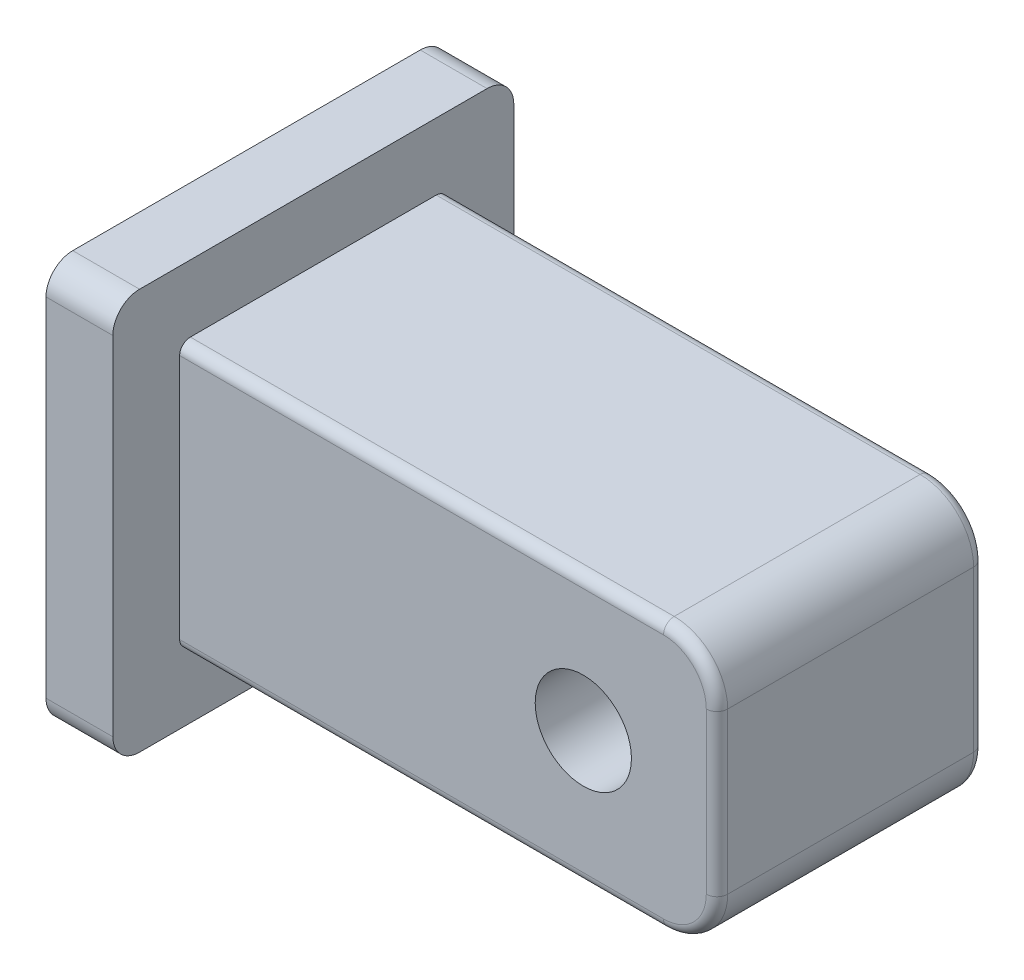
ISO-10303-21;
HEADER;
FILE_DESCRIPTION(('STEP AP214'),'2;1');
FILE_NAME('part.step','',(''),(''),'','','');
FILE_SCHEMA(('AUTOMOTIVE_DESIGN { 1 0 10303 214 1 1 1 1 }'));
ENDSEC;
DATA;
#1=APPLICATION_CONTEXT('core data for automotive mechanical design processes');
#2=APPLICATION_PROTOCOL_DEFINITION('international standard','automotive_design',2000,#1);
#3=PRODUCT_CONTEXT('',#1,'mechanical');
#4=PRODUCT('Part','Part','',(#3));
#5=PRODUCT_RELATED_PRODUCT_CATEGORY('part','',(#4));
#6=PRODUCT_DEFINITION_FORMATION('','',#4);
#7=PRODUCT_DEFINITION_CONTEXT('part definition',#1,'design');
#8=PRODUCT_DEFINITION('design','',#6,#7);
#9=PRODUCT_DEFINITION_SHAPE('','',#8);
#10=(LENGTH_UNIT() NAMED_UNIT(*) SI_UNIT(.MILLI.,.METRE.));
#11=(NAMED_UNIT(*) PLANE_ANGLE_UNIT() SI_UNIT($,.RADIAN.));
#12=(NAMED_UNIT(*) SI_UNIT($,.STERADIAN.) SOLID_ANGLE_UNIT());
#13=UNCERTAINTY_MEASURE_WITH_UNIT(LENGTH_MEASURE(1.E-05),#10,'distance_accuracy_value','');
#14=(GEOMETRIC_REPRESENTATION_CONTEXT(3) GLOBAL_UNCERTAINTY_ASSIGNED_CONTEXT((#13)) GLOBAL_UNIT_ASSIGNED_CONTEXT((#10,
#11,#12)) REPRESENTATION_CONTEXT('',''));
#15=CARTESIAN_POINT('',(0.,0.,0.));
#16=DIRECTION('',(0.,0.,1.));
#17=DIRECTION('',(1.,0.,0.));
#18=AXIS2_PLACEMENT_3D('',#15,#16,#17);
#19=CARTESIAN_POINT('',(0.,0.,12.7));
#20=DIRECTION('',(0.,-1.,0.));
#21=DIRECTION('',(1.,0.,0.));
#22=AXIS2_PLACEMENT_3D('',#19,#20,#21);
#23=PLANE('',#22);
#24=DIRECTION('',(0.,0.,-1.));
#25=VECTOR('',#24,1.);
#26=CARTESIAN_POINT('',(-2.54,0.,12.7));
#27=LINE('',#26,#25);
#28=CARTESIAN_POINT('',(-2.54,0.,12.192));
#29=VERTEX_POINT('',#28);
#30=CARTESIAN_POINT('',(-2.54,0.,0.508));
#31=VERTEX_POINT('',#30);
#32=EDGE_CURVE('E417',#29,#31,#27,.T.);
#33=ORIENTED_EDGE('',*,*,#32,.T.);
#34=DIRECTION('',(-1.,0.,0.));
#35=VECTOR('',#34,1.);
#36=CARTESIAN_POINT('',(-25.527,0.,0.508));
#37=LINE('',#36,#35);
#38=CARTESIAN_POINT('',(-25.527,0.,0.508));
#39=VERTEX_POINT('',#38);
#40=EDGE_CURVE('E195',#31,#39,#37,.T.);
#41=ORIENTED_EDGE('',*,*,#40,.T.);
#42=DIRECTION('',(0.,0.,-1.));
#43=VECTOR('',#42,1.);
#44=CARTESIAN_POINT('',(-25.527,0.,12.7));
#45=LINE('',#44,#43);
#46=CARTESIAN_POINT('',(-25.527,0.,12.192));
#47=VERTEX_POINT('',#46);
#48=EDGE_CURVE('E206',#47,#39,#45,.T.);
#49=ORIENTED_EDGE('',*,*,#48,.F.);
#50=DIRECTION('',(-1.,0.,0.));
#51=VECTOR('',#50,1.);
#52=CARTESIAN_POINT('',(0.,0.,12.192));
#53=LINE('',#52,#51);
#54=EDGE_CURVE('E268',#47,#29,#53,.F.);
#55=ORIENTED_EDGE('',*,*,#54,.T.);
#56=EDGE_LOOP('',(#33,#41,#49,#55));
#57=FACE_BOUND('',#56,.T.);
#58=ADVANCED_FACE('F43',(#57),#23,.F.);
#59=CARTESIAN_POINT('',(0.,-12.7,12.7));
#60=DIRECTION('',(0.,1.,0.));
#61=DIRECTION('',(-1.,0.,0.));
#62=AXIS2_PLACEMENT_3D('',#59,#60,#61);
#63=PLANE('',#62);
#64=DIRECTION('',(0.,0.,1.));
#65=VECTOR('',#64,1.);
#66=CARTESIAN_POINT('',(-25.527,-12.7,12.7));
#67=LINE('',#66,#65);
#68=CARTESIAN_POINT('',(-25.527,-12.7,0.508));
#69=VERTEX_POINT('',#68);
#70=CARTESIAN_POINT('',(-25.527,-12.7,12.192));
#71=VERTEX_POINT('',#70);
#72=EDGE_CURVE('E186',#69,#71,#67,.T.);
#73=ORIENTED_EDGE('',*,*,#72,.F.);
#74=DIRECTION('',(1.,0.,0.));
#75=VECTOR('',#74,1.);
#76=CARTESIAN_POINT('',(-2.54,-12.7,0.508));
#77=LINE('',#76,#75);
#78=CARTESIAN_POINT('',(-2.54,-12.7,0.508));
#79=VERTEX_POINT('',#78);
#80=EDGE_CURVE('E201',#69,#79,#77,.T.);
#81=ORIENTED_EDGE('',*,*,#80,.T.);
#82=DIRECTION('',(0.,0.,-1.));
#83=VECTOR('',#82,1.);
#84=CARTESIAN_POINT('',(-2.54,-12.7,12.7));
#85=LINE('',#84,#83);
#86=CARTESIAN_POINT('',(-2.54,-12.7,12.192));
#87=VERTEX_POINT('',#86);
#88=EDGE_CURVE('E414',#79,#87,#85,.F.);
#89=ORIENTED_EDGE('',*,*,#88,.T.);
#90=DIRECTION('',(1.,0.,0.));
#91=VECTOR('',#90,1.);
#92=CARTESIAN_POINT('',(0.,-12.7,12.192));
#93=LINE('',#92,#91);
#94=EDGE_CURVE('E204',#87,#71,#93,.F.);
#95=ORIENTED_EDGE('',*,*,#94,.T.);
#96=EDGE_LOOP('',(#73,#81,#89,#95));
#97=FACE_BOUND('',#96,.T.);
#98=ADVANCED_FACE('F199',(#97),#63,.F.);
#99=CARTESIAN_POINT('',(0.,0.,12.7));
#100=DIRECTION('',(0.,0.,-1.));
#101=DIRECTION('',(-1.,0.,0.));
#102=AXIS2_PLACEMENT_3D('',#99,#100,#101);
#103=PLANE('',#102);
#104=CARTESIAN_POINT('',(-6.35,-6.35,12.7));
#105=DIRECTION('',(0.,0.,-1.));
#106=DIRECTION('',(-1.,0.,0.));
#107=AXIS2_PLACEMENT_3D('',#104,#105,#106);
#108=CIRCLE('',#107,2.286);
#109=CARTESIAN_POINT('',(-8.636,-6.35,12.7));
#110=VERTEX_POINT('',#109);
#111=EDGE_CURVE('E402',#110,#110,#108,.T.);
#112=ORIENTED_EDGE('',*,*,#111,.T.);
#113=EDGE_LOOP('',(#112));
#114=FACE_BOUND('',#113,.T.);
#115=DIRECTION('',(0.,1.,0.));
#116=VECTOR('',#115,1.);
#117=CARTESIAN_POINT('',(-25.527,0.,12.7));
#118=LINE('',#117,#116);
#119=CARTESIAN_POINT('',(-25.527,-12.192,12.7));
#120=VERTEX_POINT('',#119);
#121=CARTESIAN_POINT('',(-25.527,-0.508000000000003,12.7));
#122=VERTEX_POINT('',#121);
#123=EDGE_CURVE('E394',#120,#122,#118,.T.);
#124=ORIENTED_EDGE('',*,*,#123,.F.);
#125=DIRECTION('',(1.,0.,0.));
#126=VECTOR('',#125,1.);
#127=CARTESIAN_POINT('',(0.,-12.192,12.7));
#128=LINE('',#127,#126);
#129=CARTESIAN_POINT('',(-2.54,-12.192,12.7));
#130=VERTEX_POINT('',#129);
#131=EDGE_CURVE('E264',#120,#130,#128,.T.);
#132=ORIENTED_EDGE('',*,*,#131,.T.);
#133=CARTESIAN_POINT('',(-2.54,-10.16,12.7));
#134=DIRECTION('',(0.,0.,-1.));
#135=DIRECTION('',(-1.,0.,0.));
#136=AXIS2_PLACEMENT_3D('',#133,#134,#135);
#137=CIRCLE('',#136,2.032);
#138=CARTESIAN_POINT('',(-0.507999999999999,-10.16,12.7));
#139=VERTEX_POINT('',#138);
#140=EDGE_CURVE('E261',#130,#139,#137,.F.);
#141=ORIENTED_EDGE('',*,*,#140,.T.);
#142=DIRECTION('',(0.,1.,0.));
#143=VECTOR('',#142,1.);
#144=CARTESIAN_POINT('',(-0.508,0.,12.7));
#145=LINE('',#144,#143);
#146=CARTESIAN_POINT('',(-0.508,-2.54,12.7));
#147=VERTEX_POINT('',#146);
#148=EDGE_CURVE('E258',#139,#147,#145,.T.);
#149=ORIENTED_EDGE('',*,*,#148,.T.);
#150=CARTESIAN_POINT('',(-2.54,-2.54,12.7));
#151=DIRECTION('',(0.,0.,-1.));
#152=DIRECTION('',(-1.,0.,0.));
#153=AXIS2_PLACEMENT_3D('',#150,#151,#152);
#154=CIRCLE('',#153,2.032);
#155=CARTESIAN_POINT('',(-2.54,-0.508,12.7));
#156=VERTEX_POINT('',#155);
#157=EDGE_CURVE('E255',#147,#156,#154,.F.);
#158=ORIENTED_EDGE('',*,*,#157,.T.);
#159=DIRECTION('',(-1.,0.,0.));
#160=VECTOR('',#159,1.);
#161=CARTESIAN_POINT('',(0.,-0.508,12.7));
#162=LINE('',#161,#160);
#163=EDGE_CURVE('E252',#156,#122,#162,.T.);
#164=ORIENTED_EDGE('',*,*,#163,.T.);
#165=EDGE_LOOP('',(#124,#132,#141,#149,#158,#164));
#166=FACE_BOUND('',#165,.T.);
#167=ADVANCED_FACE('F465',(#114,#166),#103,.F.);
#168=CARTESIAN_POINT('',(0.,0.,0.));
#169=DIRECTION('',(0.,0.,-1.));
#170=DIRECTION('',(-1.,0.,0.));
#171=AXIS2_PLACEMENT_3D('',#168,#169,#170);
#172=PLANE('',#171);
#173=CARTESIAN_POINT('',(-6.35,-6.35,0.));
#174=DIRECTION('',(0.,0.,1.));
#175=DIRECTION('',(1.,0.,0.));
#176=AXIS2_PLACEMENT_3D('',#173,#174,#175);
#177=CIRCLE('',#176,2.286);
#178=CARTESIAN_POINT('',(-4.064,-6.35,0.));
#179=VERTEX_POINT('',#178);
#180=EDGE_CURVE('E398',#179,#179,#177,.T.);
#181=ORIENTED_EDGE('',*,*,#180,.T.);
#182=EDGE_LOOP('',(#181));
#183=FACE_BOUND('',#182,.T.);
#184=CARTESIAN_POINT('',(-2.54,-10.16,0.));
#185=DIRECTION('',(0.,0.,-1.));
#186=DIRECTION('',(-1.,0.,0.));
#187=AXIS2_PLACEMENT_3D('',#184,#185,#186);
#188=CIRCLE('',#187,2.032);
#189=CARTESIAN_POINT('',(-0.507999999999999,-10.16,0.));
#190=VERTEX_POINT('',#189);
#191=CARTESIAN_POINT('',(-2.54,-12.192,0.));
#192=VERTEX_POINT('',#191);
#193=EDGE_CURVE('E228',#190,#192,#188,.T.);
#194=ORIENTED_EDGE('',*,*,#193,.T.);
#195=DIRECTION('',(1.,0.,0.));
#196=VECTOR('',#195,1.);
#197=CARTESIAN_POINT('',(-25.527,-12.192,0.));
#198=LINE('',#197,#196);
#199=CARTESIAN_POINT('',(-25.527,-12.192,0.));
#200=VERTEX_POINT('',#199);
#201=EDGE_CURVE('E231',#192,#200,#198,.F.);
#202=ORIENTED_EDGE('',*,*,#201,.T.);
#203=DIRECTION('',(0.,1.,0.));
#204=VECTOR('',#203,1.);
#205=CARTESIAN_POINT('',(-25.527,0.,0.));
#206=LINE('',#205,#204);
#207=CARTESIAN_POINT('',(-25.527,-0.508000000000003,0.));
#208=VERTEX_POINT('',#207);
#209=EDGE_CURVE('E189',#200,#208,#206,.T.);
#210=ORIENTED_EDGE('',*,*,#209,.T.);
#211=DIRECTION('',(-1.,0.,0.));
#212=VECTOR('',#211,1.);
#213=CARTESIAN_POINT('',(-2.54,-0.508,0.));
#214=LINE('',#213,#212);
#215=CARTESIAN_POINT('',(-2.54,-0.508,0.));
#216=VERTEX_POINT('',#215);
#217=EDGE_CURVE('E214',#208,#216,#214,.F.);
#218=ORIENTED_EDGE('',*,*,#217,.T.);
#219=CARTESIAN_POINT('',(-2.54,-2.54,0.));
#220=DIRECTION('',(0.,0.,-1.));
#221=DIRECTION('',(-1.,0.,0.));
#222=AXIS2_PLACEMENT_3D('',#219,#220,#221);
#223=CIRCLE('',#222,2.032);
#224=CARTESIAN_POINT('',(-0.508,-2.54,0.));
#225=VERTEX_POINT('',#224);
#226=EDGE_CURVE('E218',#216,#225,#223,.T.);
#227=ORIENTED_EDGE('',*,*,#226,.T.);
#228=DIRECTION('',(0.,1.,0.));
#229=VECTOR('',#228,1.);
#230=CARTESIAN_POINT('',(-0.507999999999999,-10.16,0.));
#231=LINE('',#230,#229);
#232=EDGE_CURVE('E225',#225,#190,#231,.F.);
#233=ORIENTED_EDGE('',*,*,#232,.T.);
#234=EDGE_LOOP('',(#194,#202,#210,#218,#227,#233));
#235=FACE_BOUND('',#234,.T.);
#236=ADVANCED_FACE('F423',(#183,#235),#172,.T.);
#237=CARTESIAN_POINT('',(0.,0.,12.7));
#238=DIRECTION('',(-1.,0.,0.));
#239=DIRECTION('',(0.,-1.,0.));
#240=AXIS2_PLACEMENT_3D('',#237,#238,#239);
#241=PLANE('',#240);
#242=DIRECTION('',(0.,0.,-1.));
#243=VECTOR('',#242,1.);
#244=CARTESIAN_POINT('',(0.,-10.16,12.7));
#245=LINE('',#244,#243);
#246=CARTESIAN_POINT('',(0.,-10.16,12.192));
#247=VERTEX_POINT('',#246);
#248=CARTESIAN_POINT('',(0.,-10.16,0.508));
#249=VERTEX_POINT('',#248);
#250=EDGE_CURVE('E410',#247,#249,#245,.T.);
#251=ORIENTED_EDGE('',*,*,#250,.T.);
#252=DIRECTION('',(0.,1.,0.));
#253=VECTOR('',#252,1.);
#254=CARTESIAN_POINT('',(0.,-2.54,0.508));
#255=LINE('',#254,#253);
#256=CARTESIAN_POINT('',(0.,-2.54,0.508));
#257=VERTEX_POINT('',#256);
#258=EDGE_CURVE('E243',#249,#257,#255,.T.);
#259=ORIENTED_EDGE('',*,*,#258,.T.);
#260=DIRECTION('',(0.,0.,-1.));
#261=VECTOR('',#260,1.);
#262=CARTESIAN_POINT('',(0.,-2.54,12.7));
#263=LINE('',#262,#261);
#264=CARTESIAN_POINT('',(0.,-2.54,12.192));
#265=VERTEX_POINT('',#264);
#266=EDGE_CURVE('E406',#257,#265,#263,.F.);
#267=ORIENTED_EDGE('',*,*,#266,.T.);
#268=DIRECTION('',(0.,1.,0.));
#269=VECTOR('',#268,1.);
#270=CARTESIAN_POINT('',(0.,0.,12.192));
#271=LINE('',#270,#269);
#272=EDGE_CURVE('E240',#265,#247,#271,.F.);
#273=ORIENTED_EDGE('',*,*,#272,.T.);
#274=EDGE_LOOP('',(#251,#259,#267,#273));
#275=FACE_BOUND('',#274,.T.);
#276=ADVANCED_FACE('F447',(#275),#241,.F.);
#277=CARTESIAN_POINT('',(-6.35,-6.35,0.));
#278=DIRECTION('',(0.,0.,1.));
#279=DIRECTION('',(1.,0.,0.));
#280=AXIS2_PLACEMENT_3D('',#277,#278,#279);
#281=CYLINDRICAL_SURFACE('',#280,2.286);
#282=ORIENTED_EDGE('',*,*,#180,.F.);
#283=EDGE_LOOP('',(#282));
#284=FACE_BOUND('',#283,.T.);
#285=ORIENTED_EDGE('',*,*,#111,.F.);
#286=EDGE_LOOP('',(#285));
#287=FACE_BOUND('',#286,.T.);
#288=ADVANCED_FACE('F490',(#284,#287),#281,.F.);
#289=CARTESIAN_POINT('',(-2.54,-10.16,12.7));
#290=DIRECTION('',(0.,0.,-1.));
#291=DIRECTION('',(-1.,0.,0.));
#292=AXIS2_PLACEMENT_3D('',#289,#290,#291);
#293=CYLINDRICAL_SURFACE('',#292,2.54);
#294=ORIENTED_EDGE('',*,*,#88,.F.);
#295=CARTESIAN_POINT('',(-2.54,-10.16,0.508));
#296=DIRECTION('',(0.,0.,-1.));
#297=DIRECTION('',(-1.,0.,0.));
#298=AXIS2_PLACEMENT_3D('',#295,#296,#297);
#299=CIRCLE('',#298,2.54);
#300=EDGE_CURVE('E237',#79,#249,#299,.F.);
#301=ORIENTED_EDGE('',*,*,#300,.T.);
#302=ORIENTED_EDGE('',*,*,#250,.F.);
#303=CARTESIAN_POINT('',(-2.54,-10.16,12.192));
#304=DIRECTION('',(0.,0.,-1.));
#305=DIRECTION('',(-1.,0.,0.));
#306=AXIS2_PLACEMENT_3D('',#303,#304,#305);
#307=CIRCLE('',#306,2.54);
#308=EDGE_CURVE('E234',#247,#87,#307,.T.);
#309=ORIENTED_EDGE('',*,*,#308,.T.);
#310=EDGE_LOOP('',(#294,#301,#302,#309));
#311=FACE_BOUND('',#310,.T.);
#312=ADVANCED_FACE('F444',(#311),#293,.T.);
#313=CARTESIAN_POINT('',(-2.54,-2.54,12.7));
#314=DIRECTION('',(0.,0.,-1.));
#315=DIRECTION('',(-1.,0.,0.));
#316=AXIS2_PLACEMENT_3D('',#313,#314,#315);
#317=CYLINDRICAL_SURFACE('',#316,2.54);
#318=ORIENTED_EDGE('',*,*,#266,.F.);
#319=CARTESIAN_POINT('',(-2.54,-2.54,0.508));
#320=DIRECTION('',(0.,0.,-1.));
#321=DIRECTION('',(-1.,0.,0.));
#322=AXIS2_PLACEMENT_3D('',#319,#320,#321);
#323=CIRCLE('',#322,2.54);
#324=EDGE_CURVE('E249',#257,#31,#323,.F.);
#325=ORIENTED_EDGE('',*,*,#324,.T.);
#326=ORIENTED_EDGE('',*,*,#32,.F.);
#327=CARTESIAN_POINT('',(-2.54,-2.54,12.192));
#328=DIRECTION('',(0.,0.,-1.));
#329=DIRECTION('',(-1.,0.,0.));
#330=AXIS2_PLACEMENT_3D('',#327,#328,#329);
#331=CIRCLE('',#330,2.54);
#332=EDGE_CURVE('E246',#29,#265,#331,.T.);
#333=ORIENTED_EDGE('',*,*,#332,.T.);
#334=EDGE_LOOP('',(#318,#325,#326,#333));
#335=FACE_BOUND('',#334,.T.);
#336=ADVANCED_FACE('F477',(#335),#317,.T.);
#337=CARTESIAN_POINT('',(-25.527,0.,0.));
#338=DIRECTION('',(-1.,0.,0.));
#339=DIRECTION('',(0.,0.,1.));
#340=AXIS2_PLACEMENT_3D('',#337,#338,#339);
#341=PLANE('',#340);
#342=DIRECTION('',(0.,0.,1.));
#343=VECTOR('',#342,1.);
#344=CARTESIAN_POINT('',(-25.527,-15.875,-3.175));
#345=LINE('',#344,#343);
#346=CARTESIAN_POINT('',(-25.527,-15.875,-1.905));
#347=VERTEX_POINT('',#346);
#348=CARTESIAN_POINT('',(-25.527,-15.875,14.605));
#349=VERTEX_POINT('',#348);
#350=EDGE_CURVE('E207',#347,#349,#345,.T.);
#351=ORIENTED_EDGE('',*,*,#350,.F.);
#352=CARTESIAN_POINT('',(-25.527,-14.605,-1.905));
#353=DIRECTION('',(-1.,0.,0.));
#354=DIRECTION('',(0.,0.,1.));
#355=AXIS2_PLACEMENT_3D('',#352,#353,#354);
#356=CIRCLE('',#355,1.27);
#357=CARTESIAN_POINT('',(-25.527,-14.605,-3.175));
#358=VERTEX_POINT('',#357);
#359=EDGE_CURVE('E345',#347,#358,#356,.F.);
#360=ORIENTED_EDGE('',*,*,#359,.T.);
#361=DIRECTION('',(0.,-1.,0.));
#362=VECTOR('',#361,1.);
#363=CARTESIAN_POINT('',(-25.527,3.175,-3.175));
#364=LINE('',#363,#362);
#365=CARTESIAN_POINT('',(-25.527,1.905,-3.175));
#366=VERTEX_POINT('',#365);
#367=EDGE_CURVE('E538',#366,#358,#364,.T.);
#368=ORIENTED_EDGE('',*,*,#367,.F.);
#369=CARTESIAN_POINT('',(-25.527,1.905,-1.905));
#370=DIRECTION('',(-1.,0.,0.));
#371=DIRECTION('',(0.,0.,1.));
#372=AXIS2_PLACEMENT_3D('',#369,#370,#371);
#373=CIRCLE('',#372,1.27);
#374=CARTESIAN_POINT('',(-25.527,3.175,-1.905));
#375=VERTEX_POINT('',#374);
#376=EDGE_CURVE('E59',#366,#375,#373,.F.);
#377=ORIENTED_EDGE('',*,*,#376,.T.);
#378=DIRECTION('',(0.,0.,-1.));
#379=VECTOR('',#378,1.);
#380=CARTESIAN_POINT('',(-25.527,3.175,-3.175));
#381=LINE('',#380,#379);
#382=CARTESIAN_POINT('',(-25.527,3.175,14.605));
#383=VERTEX_POINT('',#382);
#384=EDGE_CURVE('E370',#383,#375,#381,.T.);
#385=ORIENTED_EDGE('',*,*,#384,.F.);
#386=CARTESIAN_POINT('',(-25.527,1.905,14.605));
#387=DIRECTION('',(-1.,0.,0.));
#388=DIRECTION('',(0.,0.,1.));
#389=AXIS2_PLACEMENT_3D('',#386,#387,#388);
#390=CIRCLE('',#389,1.27);
#391=CARTESIAN_POINT('',(-25.527,1.905,15.875));
#392=VERTEX_POINT('',#391);
#393=EDGE_CURVE('E337',#383,#392,#390,.F.);
#394=ORIENTED_EDGE('',*,*,#393,.T.);
#395=DIRECTION('',(0.,1.,0.));
#396=VECTOR('',#395,1.);
#397=CARTESIAN_POINT('',(-25.527,3.175,15.875));
#398=LINE('',#397,#396);
#399=CARTESIAN_POINT('',(-25.527,-14.605,15.875));
#400=VERTEX_POINT('',#399);
#401=EDGE_CURVE('E361',#400,#392,#398,.T.);
#402=ORIENTED_EDGE('',*,*,#401,.F.);
#403=CARTESIAN_POINT('',(-25.527,-14.605,14.605));
#404=DIRECTION('',(-1.,0.,0.));
#405=DIRECTION('',(0.,0.,1.));
#406=AXIS2_PLACEMENT_3D('',#403,#404,#405);
#407=CIRCLE('',#406,1.27);
#408=EDGE_CURVE('E342',#400,#349,#407,.F.);
#409=ORIENTED_EDGE('',*,*,#408,.T.);
#410=EDGE_LOOP('',(#351,#360,#368,#377,#385,#394,#402,#409));
#411=FACE_BOUND('',#410,.T.);
#412=ORIENTED_EDGE('',*,*,#209,.F.);
#413=CARTESIAN_POINT('',(-25.527,-12.192,0.508));
#414=DIRECTION('',(-1.,0.,0.));
#415=DIRECTION('',(0.,0.,1.));
#416=AXIS2_PLACEMENT_3D('',#413,#414,#415);
#417=CIRCLE('',#416,0.508);
#418=EDGE_CURVE('E183',#200,#69,#417,.T.);
#419=ORIENTED_EDGE('',*,*,#418,.T.);
#420=ORIENTED_EDGE('',*,*,#72,.T.);
#421=CARTESIAN_POINT('',(-25.527,-12.192,12.192));
#422=DIRECTION('',(-1.,0.,0.));
#423=DIRECTION('',(0.,0.,1.));
#424=AXIS2_PLACEMENT_3D('',#421,#422,#423);
#425=CIRCLE('',#424,0.508);
#426=EDGE_CURVE('E194',#71,#120,#425,.T.);
#427=ORIENTED_EDGE('',*,*,#426,.T.);
#428=ORIENTED_EDGE('',*,*,#123,.T.);
#429=CARTESIAN_POINT('',(-25.527,-0.508000000000003,12.192));
#430=DIRECTION('',(-1.,0.,0.));
#431=DIRECTION('',(0.,0.,1.));
#432=AXIS2_PLACEMENT_3D('',#429,#430,#431);
#433=CIRCLE('',#432,0.508);
#434=EDGE_CURVE('E278',#122,#47,#433,.T.);
#435=ORIENTED_EDGE('',*,*,#434,.T.);
#436=ORIENTED_EDGE('',*,*,#48,.T.);
#437=CARTESIAN_POINT('',(-25.527,-0.508000000000003,0.508));
#438=DIRECTION('',(-1.,0.,0.));
#439=DIRECTION('',(0.,0.,1.));
#440=AXIS2_PLACEMENT_3D('',#437,#438,#439);
#441=CIRCLE('',#440,0.508);
#442=EDGE_CURVE('E275',#39,#208,#441,.T.);
#443=ORIENTED_EDGE('',*,*,#442,.T.);
#444=EDGE_LOOP('',(#412,#419,#420,#427,#428,#435,#436,#443));
#445=FACE_BOUND('',#444,.T.);
#446=ADVANCED_FACE('F185',(#411,#445),#341,.F.);
#447=CARTESIAN_POINT('',(-25.527,3.175,15.875));
#448=DIRECTION('',(0.,0.,1.));
#449=DIRECTION('',(0.,-1.,0.));
#450=AXIS2_PLACEMENT_3D('',#447,#448,#449);
#451=PLANE('',#450);
#452=DIRECTION('',(0.,1.,0.));
#453=VECTOR('',#452,1.);
#454=CARTESIAN_POINT('',(-28.702,3.175,15.875));
#455=LINE('',#454,#453);
#456=CARTESIAN_POINT('',(-28.702,-14.605,15.875));
#457=VERTEX_POINT('',#456);
#458=CARTESIAN_POINT('',(-28.702,1.905,15.875));
#459=VERTEX_POINT('',#458);
#460=EDGE_CURVE('E297',#457,#459,#455,.T.);
#461=ORIENTED_EDGE('',*,*,#460,.F.);
#462=DIRECTION('',(-1.,0.,0.));
#463=VECTOR('',#462,1.);
#464=CARTESIAN_POINT('',(-25.527,-14.605,15.875));
#465=LINE('',#464,#463);
#466=EDGE_CURVE('E352',#457,#400,#465,.F.);
#467=ORIENTED_EDGE('',*,*,#466,.T.);
#468=ORIENTED_EDGE('',*,*,#401,.T.);
#469=DIRECTION('',(-1.,0.,0.));
#470=VECTOR('',#469,1.);
#471=CARTESIAN_POINT('',(-25.527,1.905,15.875));
#472=LINE('',#471,#470);
#473=EDGE_CURVE('E348',#392,#459,#472,.T.);
#474=ORIENTED_EDGE('',*,*,#473,.T.);
#475=EDGE_LOOP('',(#461,#467,#468,#474));
#476=FACE_BOUND('',#475,.T.);
#477=ADVANCED_FACE('F360',(#476),#451,.T.);
#478=CARTESIAN_POINT('',(-25.527,-15.875,-3.175));
#479=DIRECTION('',(0.,-1.,0.));
#480=DIRECTION('',(0.,0.,-1.));
#481=AXIS2_PLACEMENT_3D('',#478,#479,#480);
#482=PLANE('',#481);
#483=DIRECTION('',(0.,0.,1.));
#484=VECTOR('',#483,1.);
#485=CARTESIAN_POINT('',(-28.702,-15.875,-3.175));
#486=LINE('',#485,#484);
#487=CARTESIAN_POINT('',(-28.702,-15.875,-1.905));
#488=VERTEX_POINT('',#487);
#489=CARTESIAN_POINT('',(-28.702,-15.875,14.605));
#490=VERTEX_POINT('',#489);
#491=EDGE_CURVE('E371',#488,#490,#486,.T.);
#492=ORIENTED_EDGE('',*,*,#491,.F.);
#493=DIRECTION('',(-1.,0.,0.));
#494=VECTOR('',#493,1.);
#495=CARTESIAN_POINT('',(-25.527,-15.875,-1.905));
#496=LINE('',#495,#494);
#497=EDGE_CURVE('E334',#488,#347,#496,.F.);
#498=ORIENTED_EDGE('',*,*,#497,.T.);
#499=ORIENTED_EDGE('',*,*,#350,.T.);
#500=DIRECTION('',(-1.,0.,0.));
#501=VECTOR('',#500,1.);
#502=CARTESIAN_POINT('',(-25.527,-15.875,14.605));
#503=LINE('',#502,#501);
#504=EDGE_CURVE('E330',#349,#490,#503,.T.);
#505=ORIENTED_EDGE('',*,*,#504,.T.);
#506=EDGE_LOOP('',(#492,#498,#499,#505));
#507=FACE_BOUND('',#506,.T.);
#508=ADVANCED_FACE('F378',(#507),#482,.T.);
#509=CARTESIAN_POINT('',(-25.527,3.175,-3.175));
#510=DIRECTION('',(0.,0.,-1.));
#511=DIRECTION('',(0.,1.,0.));
#512=AXIS2_PLACEMENT_3D('',#509,#510,#511);
#513=PLANE('',#512);
#514=ORIENTED_EDGE('',*,*,#367,.T.);
#515=DIRECTION('',(-1.,0.,0.));
#516=VECTOR('',#515,1.);
#517=CARTESIAN_POINT('',(-25.527,-14.605,-3.175));
#518=LINE('',#517,#516);
#519=CARTESIAN_POINT('',(-28.702,-14.605,-3.175));
#520=VERTEX_POINT('',#519);
#521=EDGE_CURVE('E314',#358,#520,#518,.T.);
#522=ORIENTED_EDGE('',*,*,#521,.T.);
#523=DIRECTION('',(0.,-1.,0.));
#524=VECTOR('',#523,1.);
#525=CARTESIAN_POINT('',(-28.702,3.175,-3.175));
#526=LINE('',#525,#524);
#527=CARTESIAN_POINT('',(-28.702,1.905,-3.175));
#528=VERTEX_POINT('',#527);
#529=EDGE_CURVE('E384',#528,#520,#526,.T.);
#530=ORIENTED_EDGE('',*,*,#529,.F.);
#531=DIRECTION('',(-1.,0.,0.));
#532=VECTOR('',#531,1.);
#533=CARTESIAN_POINT('',(-25.527,1.905,-3.175));
#534=LINE('',#533,#532);
#535=EDGE_CURVE('E281',#528,#366,#534,.F.);
#536=ORIENTED_EDGE('',*,*,#535,.T.);
#537=EDGE_LOOP('',(#514,#522,#530,#536));
#538=FACE_BOUND('',#537,.T.);
#539=ADVANCED_FACE('F545',(#538),#513,.T.);
#540=CARTESIAN_POINT('',(-25.527,3.175,-3.175));
#541=DIRECTION('',(0.,1.,0.));
#542=DIRECTION('',(0.,0.,1.));
#543=AXIS2_PLACEMENT_3D('',#540,#541,#542);
#544=PLANE('',#543);
#545=ORIENTED_EDGE('',*,*,#384,.T.);
#546=DIRECTION('',(-1.,0.,0.));
#547=VECTOR('',#546,1.);
#548=CARTESIAN_POINT('',(-25.527,3.175,-1.905));
#549=LINE('',#548,#547);
#550=CARTESIAN_POINT('',(-28.702,3.175,-1.905));
#551=VERTEX_POINT('',#550);
#552=EDGE_CURVE('E11',#375,#551,#549,.T.);
#553=ORIENTED_EDGE('',*,*,#552,.T.);
#554=DIRECTION('',(0.,0.,-1.));
#555=VECTOR('',#554,1.);
#556=CARTESIAN_POINT('',(-28.702,3.175,-3.175));
#557=LINE('',#556,#555);
#558=CARTESIAN_POINT('',(-28.702,3.175,14.605));
#559=VERTEX_POINT('',#558);
#560=EDGE_CURVE('E387',#559,#551,#557,.T.);
#561=ORIENTED_EDGE('',*,*,#560,.F.);
#562=DIRECTION('',(-1.,0.,0.));
#563=VECTOR('',#562,1.);
#564=CARTESIAN_POINT('',(-25.527,3.175,14.605));
#565=LINE('',#564,#563);
#566=EDGE_CURVE('E52',#559,#383,#565,.F.);
#567=ORIENTED_EDGE('',*,*,#566,.T.);
#568=EDGE_LOOP('',(#545,#553,#561,#567));
#569=FACE_BOUND('',#568,.T.);
#570=ADVANCED_FACE('F530',(#569),#544,.T.);
#571=CARTESIAN_POINT('',(-28.702,0.,12.7));
#572=DIRECTION('',(1.,0.,0.));
#573=DIRECTION('',(0.,0.,-1.));
#574=AXIS2_PLACEMENT_3D('',#571,#572,#573);
#575=PLANE('',#574);
#576=ORIENTED_EDGE('',*,*,#529,.T.);
#577=CARTESIAN_POINT('',(-28.702,-14.605,-1.905));
#578=DIRECTION('',(1.,0.,0.));
#579=DIRECTION('',(0.,0.,-1.));
#580=AXIS2_PLACEMENT_3D('',#577,#578,#579);
#581=CIRCLE('',#580,1.27);
#582=EDGE_CURVE('E327',#520,#488,#581,.F.);
#583=ORIENTED_EDGE('',*,*,#582,.T.);
#584=ORIENTED_EDGE('',*,*,#491,.T.);
#585=CARTESIAN_POINT('',(-28.702,-14.605,14.605));
#586=DIRECTION('',(1.,0.,0.));
#587=DIRECTION('',(0.,0.,-1.));
#588=AXIS2_PLACEMENT_3D('',#585,#586,#587);
#589=CIRCLE('',#588,1.27);
#590=EDGE_CURVE('E324',#490,#457,#589,.F.);
#591=ORIENTED_EDGE('',*,*,#590,.T.);
#592=ORIENTED_EDGE('',*,*,#460,.T.);
#593=CARTESIAN_POINT('',(-28.702,1.905,14.605));
#594=DIRECTION('',(1.,0.,0.));
#595=DIRECTION('',(0.,0.,-1.));
#596=AXIS2_PLACEMENT_3D('',#593,#594,#595);
#597=CIRCLE('',#596,1.27);
#598=EDGE_CURVE('E318',#459,#559,#597,.F.);
#599=ORIENTED_EDGE('',*,*,#598,.T.);
#600=ORIENTED_EDGE('',*,*,#560,.T.);
#601=CARTESIAN_POINT('',(-28.702,1.905,-1.905));
#602=DIRECTION('',(1.,0.,0.));
#603=DIRECTION('',(0.,0.,-1.));
#604=AXIS2_PLACEMENT_3D('',#601,#602,#603);
#605=CIRCLE('',#604,1.27);
#606=EDGE_CURVE('E321',#551,#528,#605,.F.);
#607=ORIENTED_EDGE('',*,*,#606,.T.);
#608=EDGE_LOOP('',(#576,#583,#584,#591,#592,#599,#600,#607));
#609=FACE_BOUND('',#608,.T.);
#610=ADVANCED_FACE('F382',(#609),#575,.F.);
#611=CARTESIAN_POINT('',(0.,-0.508,0.508));
#612=DIRECTION('',(1.,0.,0.));
#613=DIRECTION('',(0.,1.,0.));
#614=AXIS2_PLACEMENT_3D('',#611,#612,#613);
#615=CYLINDRICAL_SURFACE('',#614,0.508);
#616=ORIENTED_EDGE('',*,*,#442,.F.);
#617=ORIENTED_EDGE('',*,*,#40,.F.);
#618=CARTESIAN_POINT('',(-2.54,-0.508,0.508));
#619=DIRECTION('',(1.,0.,0.));
#620=DIRECTION('',(0.,0.,-1.));
#621=AXIS2_PLACEMENT_3D('',#618,#619,#620);
#622=CIRCLE('',#621,0.508);
#623=EDGE_CURVE('E293',#216,#31,#622,.T.);
#624=ORIENTED_EDGE('',*,*,#623,.F.);
#625=ORIENTED_EDGE('',*,*,#217,.F.);
#626=EDGE_LOOP('',(#616,#617,#624,#625));
#627=FACE_BOUND('',#626,.T.);
#628=ADVANCED_FACE('F427',(#627),#615,.T.);
#629=CARTESIAN_POINT('',(-2.54,-2.54,0.508));
#630=DIRECTION('',(0.,0.,-1.));
#631=DIRECTION('',(-1.,0.,0.));
#632=AXIS2_PLACEMENT_3D('',#629,#630,#631);
#633=TOROIDAL_SURFACE('',#632,2.032,0.508);
#634=ORIENTED_EDGE('',*,*,#623,.T.);
#635=ORIENTED_EDGE('',*,*,#324,.F.);
#636=CARTESIAN_POINT('',(-0.508,-2.54,0.508));
#637=DIRECTION('',(0.,-1.,0.));
#638=DIRECTION('',(0.,0.,-1.));
#639=AXIS2_PLACEMENT_3D('',#636,#637,#638);
#640=CIRCLE('',#639,0.508);
#641=EDGE_CURVE('E289',#225,#257,#640,.T.);
#642=ORIENTED_EDGE('',*,*,#641,.F.);
#643=ORIENTED_EDGE('',*,*,#226,.F.);
#644=EDGE_LOOP('',(#634,#635,#642,#643));
#645=FACE_BOUND('',#644,.T.);
#646=ADVANCED_FACE('F433',(#645),#633,.T.);
#647=CARTESIAN_POINT('',(-0.508,0.,0.508));
#648=DIRECTION('',(0.,-1.,0.));
#649=DIRECTION('',(1.,0.,0.));
#650=AXIS2_PLACEMENT_3D('',#647,#648,#649);
#651=CYLINDRICAL_SURFACE('',#650,0.508);
#652=ORIENTED_EDGE('',*,*,#641,.T.);
#653=ORIENTED_EDGE('',*,*,#258,.F.);
#654=CARTESIAN_POINT('',(-0.507999999999999,-10.16,0.508));
#655=DIRECTION('',(0.,-1.,0.));
#656=DIRECTION('',(0.,0.,-1.));
#657=AXIS2_PLACEMENT_3D('',#654,#655,#656);
#658=CIRCLE('',#657,0.508);
#659=EDGE_CURVE('E284',#190,#249,#658,.T.);
#660=ORIENTED_EDGE('',*,*,#659,.F.);
#661=ORIENTED_EDGE('',*,*,#232,.F.);
#662=EDGE_LOOP('',(#652,#653,#660,#661));
#663=FACE_BOUND('',#662,.T.);
#664=ADVANCED_FACE('F439',(#663),#651,.T.);
#665=CARTESIAN_POINT('',(-2.54,-10.16,0.508));
#666=DIRECTION('',(0.,0.,-1.));
#667=DIRECTION('',(-1.,0.,0.));
#668=AXIS2_PLACEMENT_3D('',#665,#666,#667);
#669=TOROIDAL_SURFACE('',#668,2.032,0.508);
#670=ORIENTED_EDGE('',*,*,#659,.T.);
#671=ORIENTED_EDGE('',*,*,#300,.F.);
#672=CARTESIAN_POINT('',(-2.54,-12.192,0.508));
#673=DIRECTION('',(-1.,0.,0.));
#674=DIRECTION('',(0.,0.,1.));
#675=AXIS2_PLACEMENT_3D('',#672,#673,#674);
#676=CIRCLE('',#675,0.508);
#677=EDGE_CURVE('E211',#192,#79,#676,.T.);
#678=ORIENTED_EDGE('',*,*,#677,.F.);
#679=ORIENTED_EDGE('',*,*,#193,.F.);
#680=EDGE_LOOP('',(#670,#671,#678,#679));
#681=FACE_BOUND('',#680,.T.);
#682=ADVANCED_FACE('F441',(#681),#669,.T.);
#683=CARTESIAN_POINT('',(0.,-12.192,0.508));
#684=DIRECTION('',(-1.,0.,0.));
#685=DIRECTION('',(0.,-1.,0.));
#686=AXIS2_PLACEMENT_3D('',#683,#684,#685);
#687=CYLINDRICAL_SURFACE('',#686,0.508);
#688=ORIENTED_EDGE('',*,*,#418,.F.);
#689=ORIENTED_EDGE('',*,*,#201,.F.);
#690=ORIENTED_EDGE('',*,*,#677,.T.);
#691=ORIENTED_EDGE('',*,*,#80,.F.);
#692=EDGE_LOOP('',(#688,#689,#690,#691));
#693=FACE_BOUND('',#692,.T.);
#694=ADVANCED_FACE('F209',(#693),#687,.T.);
#695=CARTESIAN_POINT('',(0.,-0.508,12.192));
#696=DIRECTION('',(-1.,0.,0.));
#697=DIRECTION('',(0.,-1.,0.));
#698=AXIS2_PLACEMENT_3D('',#695,#696,#697);
#699=CYLINDRICAL_SURFACE('',#698,0.508);
#700=ORIENTED_EDGE('',*,*,#434,.F.);
#701=ORIENTED_EDGE('',*,*,#163,.F.);
#702=CARTESIAN_POINT('',(-2.54,-0.508,12.192));
#703=DIRECTION('',(1.,0.,0.));
#704=DIRECTION('',(0.,0.,-1.));
#705=AXIS2_PLACEMENT_3D('',#702,#703,#704);
#706=CIRCLE('',#705,0.508);
#707=EDGE_CURVE('E285',#29,#156,#706,.T.);
#708=ORIENTED_EDGE('',*,*,#707,.F.);
#709=ORIENTED_EDGE('',*,*,#54,.F.);
#710=EDGE_LOOP('',(#700,#701,#708,#709));
#711=FACE_BOUND('',#710,.T.);
#712=ADVANCED_FACE('F470',(#711),#699,.T.);
#713=CARTESIAN_POINT('',(-2.54,-2.54,12.192));
#714=DIRECTION('',(0.,0.,-1.));
#715=DIRECTION('',(-1.,0.,0.));
#716=AXIS2_PLACEMENT_3D('',#713,#714,#715);
#717=TOROIDAL_SURFACE('',#716,2.032,0.508);
#718=ORIENTED_EDGE('',*,*,#707,.T.);
#719=ORIENTED_EDGE('',*,*,#157,.F.);
#720=CARTESIAN_POINT('',(-0.508,-2.54,12.192));
#721=DIRECTION('',(0.,-1.,0.));
#722=DIRECTION('',(0.,0.,-1.));
#723=AXIS2_PLACEMENT_3D('',#720,#721,#722);
#724=CIRCLE('',#723,0.508);
#725=EDGE_CURVE('E305',#265,#147,#724,.T.);
#726=ORIENTED_EDGE('',*,*,#725,.F.);
#727=ORIENTED_EDGE('',*,*,#332,.F.);
#728=EDGE_LOOP('',(#718,#719,#726,#727));
#729=FACE_BOUND('',#728,.T.);
#730=ADVANCED_FACE('F474',(#729),#717,.T.);
#731=CARTESIAN_POINT('',(-0.508,0.,12.192));
#732=DIRECTION('',(0.,1.,0.));
#733=DIRECTION('',(-1.,0.,0.));
#734=AXIS2_PLACEMENT_3D('',#731,#732,#733);
#735=CYLINDRICAL_SURFACE('',#734,0.508);
#736=ORIENTED_EDGE('',*,*,#725,.T.);
#737=ORIENTED_EDGE('',*,*,#148,.F.);
#738=CARTESIAN_POINT('',(-0.507999999999999,-10.16,12.192));
#739=DIRECTION('',(0.,-1.,0.));
#740=DIRECTION('',(0.,0.,-1.));
#741=AXIS2_PLACEMENT_3D('',#738,#739,#740);
#742=CIRCLE('',#741,0.508);
#743=EDGE_CURVE('E301',#247,#139,#742,.T.);
#744=ORIENTED_EDGE('',*,*,#743,.F.);
#745=ORIENTED_EDGE('',*,*,#272,.F.);
#746=EDGE_LOOP('',(#736,#737,#744,#745));
#747=FACE_BOUND('',#746,.T.);
#748=ADVANCED_FACE('F452',(#747),#735,.T.);
#749=CARTESIAN_POINT('',(-2.54,-10.16,12.192));
#750=DIRECTION('',(0.,0.,-1.));
#751=DIRECTION('',(-1.,0.,0.));
#752=AXIS2_PLACEMENT_3D('',#749,#750,#751);
#753=TOROIDAL_SURFACE('',#752,2.032,0.508);
#754=ORIENTED_EDGE('',*,*,#743,.T.);
#755=ORIENTED_EDGE('',*,*,#140,.F.);
#756=CARTESIAN_POINT('',(-2.54,-12.192,12.192));
#757=DIRECTION('',(-1.,0.,0.));
#758=DIRECTION('',(0.,0.,1.));
#759=AXIS2_PLACEMENT_3D('',#756,#757,#758);
#760=CIRCLE('',#759,0.508);
#761=EDGE_CURVE('E298',#87,#130,#760,.T.);
#762=ORIENTED_EDGE('',*,*,#761,.F.);
#763=ORIENTED_EDGE('',*,*,#308,.F.);
#764=EDGE_LOOP('',(#754,#755,#762,#763));
#765=FACE_BOUND('',#764,.T.);
#766=ADVANCED_FACE('F458',(#765),#753,.T.);
#767=CARTESIAN_POINT('',(0.,-12.192,12.192));
#768=DIRECTION('',(1.,0.,0.));
#769=DIRECTION('',(0.,1.,0.));
#770=AXIS2_PLACEMENT_3D('',#767,#768,#769);
#771=CYLINDRICAL_SURFACE('',#770,0.508);
#772=ORIENTED_EDGE('',*,*,#426,.F.);
#773=ORIENTED_EDGE('',*,*,#94,.F.);
#774=ORIENTED_EDGE('',*,*,#761,.T.);
#775=ORIENTED_EDGE('',*,*,#131,.F.);
#776=EDGE_LOOP('',(#772,#773,#774,#775));
#777=FACE_BOUND('',#776,.T.);
#778=ADVANCED_FACE('F460',(#777),#771,.T.);
#779=CARTESIAN_POINT('',(-25.527,-14.605,-1.905));
#780=DIRECTION('',(-1.,0.,0.));
#781=DIRECTION('',(0.,0.,1.));
#782=AXIS2_PLACEMENT_3D('',#779,#780,#781);
#783=CYLINDRICAL_SURFACE('',#782,1.27);
#784=ORIENTED_EDGE('',*,*,#359,.F.);
#785=ORIENTED_EDGE('',*,*,#497,.F.);
#786=ORIENTED_EDGE('',*,*,#582,.F.);
#787=ORIENTED_EDGE('',*,*,#521,.F.);
#788=EDGE_LOOP('',(#784,#785,#786,#787));
#789=FACE_BOUND('',#788,.T.);
#790=ADVANCED_FACE('F507',(#789),#783,.T.);
#791=CARTESIAN_POINT('',(-25.527,-14.605,14.605));
#792=DIRECTION('',(-1.,0.,0.));
#793=DIRECTION('',(0.,0.,1.));
#794=AXIS2_PLACEMENT_3D('',#791,#792,#793);
#795=CYLINDRICAL_SURFACE('',#794,1.27);
#796=ORIENTED_EDGE('',*,*,#408,.F.);
#797=ORIENTED_EDGE('',*,*,#466,.F.);
#798=ORIENTED_EDGE('',*,*,#590,.F.);
#799=ORIENTED_EDGE('',*,*,#504,.F.);
#800=EDGE_LOOP('',(#796,#797,#798,#799));
#801=FACE_BOUND('',#800,.T.);
#802=ADVANCED_FACE('F374',(#801),#795,.T.);
#803=CARTESIAN_POINT('',(-25.527,1.905,-1.905));
#804=DIRECTION('',(-1.,0.,0.));
#805=DIRECTION('',(0.,0.,1.));
#806=AXIS2_PLACEMENT_3D('',#803,#804,#805);
#807=CYLINDRICAL_SURFACE('',#806,1.27);
#808=ORIENTED_EDGE('',*,*,#376,.F.);
#809=ORIENTED_EDGE('',*,*,#535,.F.);
#810=ORIENTED_EDGE('',*,*,#606,.F.);
#811=ORIENTED_EDGE('',*,*,#552,.F.);
#812=EDGE_LOOP('',(#808,#809,#810,#811));
#813=FACE_BOUND('',#812,.T.);
#814=ADVANCED_FACE('F520',(#813),#807,.T.);
#815=CARTESIAN_POINT('',(-25.527,1.905,14.605));
#816=DIRECTION('',(-1.,0.,0.));
#817=DIRECTION('',(0.,0.,1.));
#818=AXIS2_PLACEMENT_3D('',#815,#816,#817);
#819=CYLINDRICAL_SURFACE('',#818,1.27);
#820=ORIENTED_EDGE('',*,*,#393,.F.);
#821=ORIENTED_EDGE('',*,*,#566,.F.);
#822=ORIENTED_EDGE('',*,*,#598,.F.);
#823=ORIENTED_EDGE('',*,*,#473,.F.);
#824=EDGE_LOOP('',(#820,#821,#822,#823));
#825=FACE_BOUND('',#824,.T.);
#826=ADVANCED_FACE('F45',(#825),#819,.T.);
#827=CLOSED_SHELL('',(#58,#98,#167,#236,#276,#288,#312,#336,#446,#477,#508,#539,#570,#610,#628,
#646,#664,#682,#694,#712,#730,#748,#766,#778,#790,#802,#814,#826));
#828=MANIFOLD_SOLID_BREP('B2',#827);
#829=ADVANCED_BREP_SHAPE_REPRESENTATION('',(#18,#828),#14);
#830=SHAPE_DEFINITION_REPRESENTATION(#9,#829);
ENDSEC;
END-ISO-10303-21;
